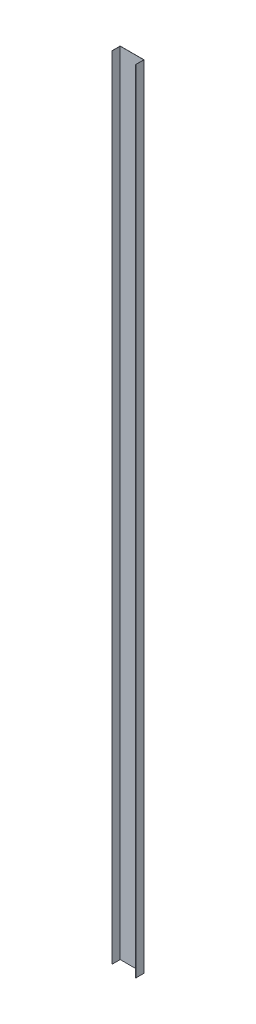
ISO-10303-21;
HEADER;
FILE_DESCRIPTION(('STEP AP214'),'2;1');
FILE_NAME('part.step','',(''),(''),'','','');
FILE_SCHEMA(('AUTOMOTIVE_DESIGN { 1 0 10303 214 1 1 1 1 }'));
ENDSEC;
DATA;
#1=APPLICATION_CONTEXT('core data for automotive mechanical design processes');
#2=APPLICATION_PROTOCOL_DEFINITION('international standard','automotive_design',2000,#1);
#3=PRODUCT_CONTEXT('',#1,'mechanical');
#4=PRODUCT('Part','Part','',(#3));
#5=PRODUCT_RELATED_PRODUCT_CATEGORY('part','',(#4));
#6=PRODUCT_DEFINITION_FORMATION('','',#4);
#7=PRODUCT_DEFINITION_CONTEXT('part definition',#1,'design');
#8=PRODUCT_DEFINITION('design','',#6,#7);
#9=PRODUCT_DEFINITION_SHAPE('','',#8);
#10=(LENGTH_UNIT() NAMED_UNIT(*) SI_UNIT(.MILLI.,.METRE.));
#11=(NAMED_UNIT(*) PLANE_ANGLE_UNIT() SI_UNIT($,.RADIAN.));
#12=(NAMED_UNIT(*) SI_UNIT($,.STERADIAN.) SOLID_ANGLE_UNIT());
#13=UNCERTAINTY_MEASURE_WITH_UNIT(LENGTH_MEASURE(1.E-05),#10,'distance_accuracy_value','');
#14=(GEOMETRIC_REPRESENTATION_CONTEXT(3) GLOBAL_UNCERTAINTY_ASSIGNED_CONTEXT((#13)) GLOBAL_UNIT_ASSIGNED_CONTEXT((#10,
#11,#12)) REPRESENTATION_CONTEXT('',''));
#15=CARTESIAN_POINT('',(0.,0.,0.));
#16=DIRECTION('',(0.,0.,1.));
#17=DIRECTION('',(1.,0.,0.));
#18=AXIS2_PLACEMENT_3D('',#15,#16,#17);
#19=CARTESIAN_POINT('',(-0.530999999999989,3048.,0.));
#20=DIRECTION('',(0.,0.,-1.));
#21=DIRECTION('',(-1.,0.,0.));
#22=AXIS2_PLACEMENT_3D('',#19,#20,#21);
#23=PLANE('',#22);
#24=DIRECTION('',(1.,0.,0.));
#25=VECTOR('',#24,1.);
#26=CARTESIAN_POINT('',(-0.530999999999989,0.,0.));
#27=LINE('',#26,#25);
#28=CARTESIAN_POINT('',(-0.530999999999989,0.,0.));
#29=VERTEX_POINT('',#28);
#30=CARTESIAN_POINT('',(0.,0.,0.));
#31=VERTEX_POINT('',#30);
#32=EDGE_CURVE('E129',#29,#31,#27,.T.);
#33=ORIENTED_EDGE('',*,*,#32,.T.);
#34=DIRECTION('',(0.,-1.,0.));
#35=VECTOR('',#34,1.);
#36=CARTESIAN_POINT('',(0.,3048.,0.));
#37=LINE('',#36,#35);
#38=CARTESIAN_POINT('',(0.,3048.,0.));
#39=VERTEX_POINT('',#38);
#40=EDGE_CURVE('E11',#39,#31,#37,.T.);
#41=ORIENTED_EDGE('',*,*,#40,.F.);
#42=DIRECTION('',(1.,0.,0.));
#43=VECTOR('',#42,1.);
#44=CARTESIAN_POINT('',(-0.530999999999989,3048.,0.));
#45=LINE('',#44,#43);
#46=CARTESIAN_POINT('',(-0.530999999999989,3048.,0.));
#47=VERTEX_POINT('',#46);
#48=EDGE_CURVE('E143',#47,#39,#45,.T.);
#49=ORIENTED_EDGE('',*,*,#48,.F.);
#50=DIRECTION('',(0.,-1.,0.));
#51=VECTOR('',#50,1.);
#52=CARTESIAN_POINT('',(-0.530999999999989,3048.,0.));
#53=LINE('',#52,#51);
#54=EDGE_CURVE('E125',#47,#29,#53,.T.);
#55=ORIENTED_EDGE('',*,*,#54,.T.);
#56=EDGE_LOOP('',(#33,#41,#49,#55));
#57=FACE_BOUND('',#56,.T.);
#58=ADVANCED_FACE('F33',(#57),#23,.F.);
#59=CARTESIAN_POINT('',(0.,3048.,0.));
#60=DIRECTION('',(-1.,0.,0.));
#61=DIRECTION('',(0.,0.,1.));
#62=AXIS2_PLACEMENT_3D('',#59,#60,#61);
#63=PLANE('',#62);
#64=DIRECTION('',(0.,0.,-1.));
#65=VECTOR('',#64,1.);
#66=CARTESIAN_POINT('',(0.,0.,0.));
#67=LINE('',#66,#65);
#68=CARTESIAN_POINT('',(0.,0.,-31.219));
#69=VERTEX_POINT('',#68);
#70=EDGE_CURVE('E132',#31,#69,#67,.T.);
#71=ORIENTED_EDGE('',*,*,#70,.T.);
#72=DIRECTION('',(0.,-1.,0.));
#73=VECTOR('',#72,1.);
#74=CARTESIAN_POINT('',(0.,3048.,-31.219));
#75=LINE('',#74,#73);
#76=CARTESIAN_POINT('',(0.,3048.,-31.219));
#77=VERTEX_POINT('',#76);
#78=EDGE_CURVE('E41',#77,#69,#75,.T.);
#79=ORIENTED_EDGE('',*,*,#78,.F.);
#80=DIRECTION('',(0.,0.,-1.));
#81=VECTOR('',#80,1.);
#82=CARTESIAN_POINT('',(0.,3048.,0.));
#83=LINE('',#82,#81);
#84=EDGE_CURVE('E92',#39,#77,#83,.T.);
#85=ORIENTED_EDGE('',*,*,#84,.F.);
#86=ORIENTED_EDGE('',*,*,#40,.T.);
#87=EDGE_LOOP('',(#71,#79,#85,#86));
#88=FACE_BOUND('',#87,.T.);
#89=ADVANCED_FACE('F178',(#88),#63,.F.);
#90=CARTESIAN_POINT('',(0.,3048.,-31.219));
#91=DIRECTION('',(0.,0.,-1.));
#92=DIRECTION('',(-1.,0.,0.));
#93=AXIS2_PLACEMENT_3D('',#90,#91,#92);
#94=PLANE('',#93);
#95=DIRECTION('',(1.,0.,0.));
#96=VECTOR('',#95,1.);
#97=CARTESIAN_POINT('',(0.,0.,-31.219));
#98=LINE('',#97,#96);
#99=CARTESIAN_POINT('',(91.013,0.,-31.219));
#100=VERTEX_POINT('',#99);
#101=EDGE_CURVE('E134',#69,#100,#98,.T.);
#102=ORIENTED_EDGE('',*,*,#101,.T.);
#103=DIRECTION('',(0.,-1.,0.));
#104=VECTOR('',#103,1.);
#105=CARTESIAN_POINT('',(91.013,3048.,-31.219));
#106=LINE('',#105,#104);
#107=CARTESIAN_POINT('',(91.013,3048.,-31.219));
#108=VERTEX_POINT('',#107);
#109=EDGE_CURVE('E150',#108,#100,#106,.T.);
#110=ORIENTED_EDGE('',*,*,#109,.F.);
#111=DIRECTION('',(1.,0.,0.));
#112=VECTOR('',#111,1.);
#113=CARTESIAN_POINT('',(0.,3048.,-31.219));
#114=LINE('',#113,#112);
#115=EDGE_CURVE('E158',#77,#108,#114,.T.);
#116=ORIENTED_EDGE('',*,*,#115,.F.);
#117=ORIENTED_EDGE('',*,*,#78,.T.);
#118=EDGE_LOOP('',(#102,#110,#116,#117));
#119=FACE_BOUND('',#118,.T.);
#120=ADVANCED_FACE('F156',(#119),#94,.F.);
#121=CARTESIAN_POINT('',(91.013,3048.,-31.219));
#122=DIRECTION('',(1.,0.,0.));
#123=DIRECTION('',(0.,0.,-1.));
#124=AXIS2_PLACEMENT_3D('',#121,#122,#123);
#125=PLANE('',#124);
#126=DIRECTION('',(0.,0.,1.));
#127=VECTOR('',#126,1.);
#128=CARTESIAN_POINT('',(91.013,0.,-31.219));
#129=LINE('',#128,#127);
#130=CARTESIAN_POINT('',(91.013,0.,0.));
#131=VERTEX_POINT('',#130);
#132=EDGE_CURVE('E136',#100,#131,#129,.T.);
#133=ORIENTED_EDGE('',*,*,#132,.T.);
#134=DIRECTION('',(0.,-1.,0.));
#135=VECTOR('',#134,1.);
#136=CARTESIAN_POINT('',(91.013,3048.,0.));
#137=LINE('',#136,#135);
#138=CARTESIAN_POINT('',(91.013,3048.,0.));
#139=VERTEX_POINT('',#138);
#140=EDGE_CURVE('E147',#139,#131,#137,.T.);
#141=ORIENTED_EDGE('',*,*,#140,.F.);
#142=DIRECTION('',(0.,0.,1.));
#143=VECTOR('',#142,1.);
#144=CARTESIAN_POINT('',(91.013,3048.,-31.219));
#145=LINE('',#144,#143);
#146=EDGE_CURVE('E170',#108,#139,#145,.T.);
#147=ORIENTED_EDGE('',*,*,#146,.F.);
#148=ORIENTED_EDGE('',*,*,#109,.T.);
#149=EDGE_LOOP('',(#133,#141,#147,#148));
#150=FACE_BOUND('',#149,.T.);
#151=ADVANCED_FACE('F166',(#150),#125,.F.);
#152=CARTESIAN_POINT('',(91.013,3048.,0.));
#153=DIRECTION('',(0.,0.,-1.));
#154=DIRECTION('',(-1.,0.,0.));
#155=AXIS2_PLACEMENT_3D('',#152,#153,#154);
#156=PLANE('',#155);
#157=DIRECTION('',(1.,0.,0.));
#158=VECTOR('',#157,1.);
#159=CARTESIAN_POINT('',(91.013,0.,0.));
#160=LINE('',#159,#158);
#161=CARTESIAN_POINT('',(91.544,0.,0.));
#162=VERTEX_POINT('',#161);
#163=EDGE_CURVE('E138',#131,#162,#160,.T.);
#164=ORIENTED_EDGE('',*,*,#163,.T.);
#165=DIRECTION('',(0.,-1.,0.));
#166=VECTOR('',#165,1.);
#167=CARTESIAN_POINT('',(91.544,3048.,0.));
#168=LINE('',#167,#166);
#169=CARTESIAN_POINT('',(91.544,3048.,0.));
#170=VERTEX_POINT('',#169);
#171=EDGE_CURVE('E120',#170,#162,#168,.T.);
#172=ORIENTED_EDGE('',*,*,#171,.F.);
#173=DIRECTION('',(1.,0.,0.));
#174=VECTOR('',#173,1.);
#175=CARTESIAN_POINT('',(91.013,3048.,0.));
#176=LINE('',#175,#174);
#177=EDGE_CURVE('E111',#139,#170,#176,.T.);
#178=ORIENTED_EDGE('',*,*,#177,.F.);
#179=ORIENTED_EDGE('',*,*,#140,.T.);
#180=EDGE_LOOP('',(#164,#172,#178,#179));
#181=FACE_BOUND('',#180,.T.);
#182=ADVANCED_FACE('F169',(#181),#156,.F.);
#183=CARTESIAN_POINT('',(91.544,3048.,0.));
#184=DIRECTION('',(-1.,0.,0.));
#185=DIRECTION('',(0.,0.,1.));
#186=AXIS2_PLACEMENT_3D('',#183,#184,#185);
#187=PLANE('',#186);
#188=DIRECTION('',(0.,0.,-1.));
#189=VECTOR('',#188,1.);
#190=CARTESIAN_POINT('',(91.544,0.,0.));
#191=LINE('',#190,#189);
#192=CARTESIAN_POINT('',(91.544,0.,-31.75));
#193=VERTEX_POINT('',#192);
#194=EDGE_CURVE('E119',#162,#193,#191,.T.);
#195=ORIENTED_EDGE('',*,*,#194,.T.);
#196=DIRECTION('',(0.,-1.,0.));
#197=VECTOR('',#196,1.);
#198=CARTESIAN_POINT('',(91.544,3048.,-31.75));
#199=LINE('',#198,#197);
#200=CARTESIAN_POINT('',(91.544,3048.,-31.75));
#201=VERTEX_POINT('',#200);
#202=EDGE_CURVE('E116',#201,#193,#199,.T.);
#203=ORIENTED_EDGE('',*,*,#202,.F.);
#204=DIRECTION('',(0.,0.,-1.));
#205=VECTOR('',#204,1.);
#206=CARTESIAN_POINT('',(91.544,3048.,0.));
#207=LINE('',#206,#205);
#208=EDGE_CURVE('E105',#170,#201,#207,.T.);
#209=ORIENTED_EDGE('',*,*,#208,.F.);
#210=ORIENTED_EDGE('',*,*,#171,.T.);
#211=EDGE_LOOP('',(#195,#203,#209,#210));
#212=FACE_BOUND('',#211,.T.);
#213=ADVANCED_FACE('F117',(#212),#187,.F.);
#214=CARTESIAN_POINT('',(91.544,3048.,-31.75));
#215=DIRECTION('',(0.,0.,1.));
#216=DIRECTION('',(1.,0.,0.));
#217=AXIS2_PLACEMENT_3D('',#214,#215,#216);
#218=PLANE('',#217);
#219=DIRECTION('',(-1.,0.,0.));
#220=VECTOR('',#219,1.);
#221=CARTESIAN_POINT('',(91.544,0.,-31.75));
#222=LINE('',#221,#220);
#223=CARTESIAN_POINT('',(-0.530999999999993,0.,-31.75));
#224=VERTEX_POINT('',#223);
#225=EDGE_CURVE('E78',#193,#224,#222,.T.);
#226=ORIENTED_EDGE('',*,*,#225,.T.);
#227=DIRECTION('',(0.,-1.,0.));
#228=VECTOR('',#227,1.);
#229=CARTESIAN_POINT('',(-0.530999999999993,3048.,-31.75));
#230=LINE('',#229,#228);
#231=CARTESIAN_POINT('',(-0.530999999999993,3048.,-31.75));
#232=VERTEX_POINT('',#231);
#233=EDGE_CURVE('E121',#232,#224,#230,.T.);
#234=ORIENTED_EDGE('',*,*,#233,.F.);
#235=DIRECTION('',(-1.,0.,0.));
#236=VECTOR('',#235,1.);
#237=CARTESIAN_POINT('',(91.544,3048.,-31.75));
#238=LINE('',#237,#236);
#239=EDGE_CURVE('E109',#201,#232,#238,.T.);
#240=ORIENTED_EDGE('',*,*,#239,.F.);
#241=ORIENTED_EDGE('',*,*,#202,.T.);
#242=EDGE_LOOP('',(#226,#234,#240,#241));
#243=FACE_BOUND('',#242,.T.);
#244=ADVANCED_FACE('F123',(#243),#218,.F.);
#245=CARTESIAN_POINT('',(-0.530999999999993,3048.,-31.75));
#246=DIRECTION('',(1.,0.,0.));
#247=DIRECTION('',(0.,0.,-1.));
#248=AXIS2_PLACEMENT_3D('',#245,#246,#247);
#249=PLANE('',#248);
#250=DIRECTION('',(0.,0.,1.));
#251=VECTOR('',#250,1.);
#252=CARTESIAN_POINT('',(-0.530999999999993,0.,-31.75));
#253=LINE('',#252,#251);
#254=EDGE_CURVE('E84',#224,#29,#253,.T.);
#255=ORIENTED_EDGE('',*,*,#254,.T.);
#256=ORIENTED_EDGE('',*,*,#54,.F.);
#257=DIRECTION('',(0.,0.,1.));
#258=VECTOR('',#257,1.);
#259=CARTESIAN_POINT('',(-0.530999999999993,3048.,-31.75));
#260=LINE('',#259,#258);
#261=EDGE_CURVE('E49',#232,#47,#260,.T.);
#262=ORIENTED_EDGE('',*,*,#261,.F.);
#263=ORIENTED_EDGE('',*,*,#233,.T.);
#264=EDGE_LOOP('',(#255,#256,#262,#263));
#265=FACE_BOUND('',#264,.T.);
#266=ADVANCED_FACE('F194',(#265),#249,.F.);
#267=CARTESIAN_POINT('',(0.,3048.,0.));
#268=DIRECTION('',(0.,1.,0.));
#269=DIRECTION('',(0.,0.,1.));
#270=AXIS2_PLACEMENT_3D('',#267,#268,#269);
#271=PLANE('',#270);
#272=ORIENTED_EDGE('',*,*,#48,.T.);
#273=ORIENTED_EDGE('',*,*,#84,.T.);
#274=ORIENTED_EDGE('',*,*,#115,.T.);
#275=ORIENTED_EDGE('',*,*,#146,.T.);
#276=ORIENTED_EDGE('',*,*,#177,.T.);
#277=ORIENTED_EDGE('',*,*,#208,.T.);
#278=ORIENTED_EDGE('',*,*,#239,.T.);
#279=ORIENTED_EDGE('',*,*,#261,.T.);
#280=EDGE_LOOP('',(#272,#273,#274,#275,#276,#277,#278,#279));
#281=FACE_BOUND('',#280,.T.);
#282=ADVANCED_FACE('F107',(#281),#271,.T.);
#283=CARTESIAN_POINT('',(0.,0.,0.));
#284=DIRECTION('',(0.,1.,0.));
#285=DIRECTION('',(0.,0.,1.));
#286=AXIS2_PLACEMENT_3D('',#283,#284,#285);
#287=PLANE('',#286);
#288=ORIENTED_EDGE('',*,*,#32,.F.);
#289=ORIENTED_EDGE('',*,*,#254,.F.);
#290=ORIENTED_EDGE('',*,*,#225,.F.);
#291=ORIENTED_EDGE('',*,*,#194,.F.);
#292=ORIENTED_EDGE('',*,*,#163,.F.);
#293=ORIENTED_EDGE('',*,*,#132,.F.);
#294=ORIENTED_EDGE('',*,*,#101,.F.);
#295=ORIENTED_EDGE('',*,*,#70,.F.);
#296=EDGE_LOOP('',(#288,#289,#290,#291,#292,#293,#294,#295));
#297=FACE_BOUND('',#296,.T.);
#298=ADVANCED_FACE('F162',(#297),#287,.F.);
#299=CLOSED_SHELL('',(#58,#89,#120,#151,#182,#213,#244,#266,#282,#298));
#300=MANIFOLD_SOLID_BREP('B2',#299);
#301=ADVANCED_BREP_SHAPE_REPRESENTATION('',(#18,#300),#14);
#302=SHAPE_DEFINITION_REPRESENTATION(#9,#301);
ENDSEC;
END-ISO-10303-21;
